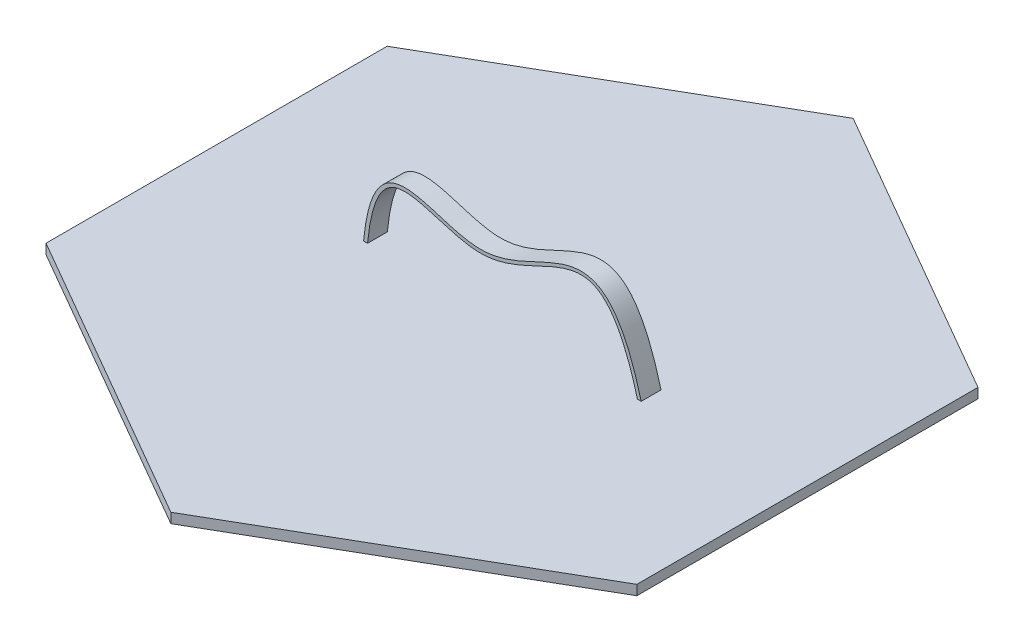
ISO-10303-21;
HEADER;
FILE_DESCRIPTION(('STEP AP214'),'2;1');
FILE_NAME('part.step','',(''),(''),'','','');
FILE_SCHEMA(('AUTOMOTIVE_DESIGN { 1 0 10303 214 1 1 1 1 }'));
ENDSEC;
DATA;
#1=APPLICATION_CONTEXT('core data for automotive mechanical design processes');
#2=APPLICATION_PROTOCOL_DEFINITION('international standard','automotive_design',2000,#1);
#3=PRODUCT_CONTEXT('',#1,'mechanical');
#4=PRODUCT('Part','Part','',(#3));
#5=PRODUCT_RELATED_PRODUCT_CATEGORY('part','',(#4));
#6=PRODUCT_DEFINITION_FORMATION('','',#4);
#7=PRODUCT_DEFINITION_CONTEXT('part definition',#1,'design');
#8=PRODUCT_DEFINITION('design','',#6,#7);
#9=PRODUCT_DEFINITION_SHAPE('','',#8);
#10=(LENGTH_UNIT() NAMED_UNIT(*) SI_UNIT(.MILLI.,.METRE.));
#11=(NAMED_UNIT(*) PLANE_ANGLE_UNIT() SI_UNIT($,.RADIAN.));
#12=(NAMED_UNIT(*) SI_UNIT($,.STERADIAN.) SOLID_ANGLE_UNIT());
#13=UNCERTAINTY_MEASURE_WITH_UNIT(LENGTH_MEASURE(1.E-05),#10,'distance_accuracy_value','');
#14=(GEOMETRIC_REPRESENTATION_CONTEXT(3) GLOBAL_UNCERTAINTY_ASSIGNED_CONTEXT((#13)) GLOBAL_UNIT_ASSIGNED_CONTEXT((#10,
#11,#12)) REPRESENTATION_CONTEXT('',''));
#15=CARTESIAN_POINT('',(0.,0.,0.));
#16=DIRECTION('',(0.,0.,1.));
#17=DIRECTION('',(1.,0.,0.));
#18=AXIS2_PLACEMENT_3D('',#15,#16,#17);
#19=CARTESIAN_POINT('',(0.,2.5,-86.));
#20=DIRECTION('',(0.5,0.,0.866025403784439));
#21=DIRECTION('',(0.866025403784439,0.,-0.5));
#22=AXIS2_PLACEMENT_3D('',#19,#20,#21);
#23=PLANE('',#22);
#24=DIRECTION('',(-0.866025403784439,0.,0.5));
#25=VECTOR('',#24,1.);
#26=CARTESIAN_POINT('',(0.,0.,-86.));
#27=LINE('',#26,#25);
#28=CARTESIAN_POINT('',(0.,0.,-86.));
#29=VERTEX_POINT('',#28);
#30=CARTESIAN_POINT('',(-74.4781847254617,0.,-43.));
#31=VERTEX_POINT('',#30);
#32=EDGE_CURVE('E124',#29,#31,#27,.T.);
#33=ORIENTED_EDGE('',*,*,#32,.T.);
#34=DIRECTION('',(0.,-1.,0.));
#35=VECTOR('',#34,1.);
#36=CARTESIAN_POINT('',(-74.4781847254617,2.5,-43.));
#37=LINE('',#36,#35);
#38=CARTESIAN_POINT('',(-74.4781847254617,2.5,-43.));
#39=VERTEX_POINT('',#38);
#40=EDGE_CURVE('E11',#39,#31,#37,.T.);
#41=ORIENTED_EDGE('',*,*,#40,.F.);
#42=DIRECTION('',(-0.866025403784439,0.,0.5));
#43=VECTOR('',#42,1.);
#44=CARTESIAN_POINT('',(0.,2.5,-86.));
#45=LINE('',#44,#43);
#46=CARTESIAN_POINT('',(0.,2.5,-86.));
#47=VERTEX_POINT('',#46);
#48=EDGE_CURVE('E208',#47,#39,#45,.T.);
#49=ORIENTED_EDGE('',*,*,#48,.F.);
#50=DIRECTION('',(0.,-1.,0.));
#51=VECTOR('',#50,1.);
#52=CARTESIAN_POINT('',(0.,2.5,-86.));
#53=LINE('',#52,#51);
#54=EDGE_CURVE('E209',#47,#29,#53,.T.);
#55=ORIENTED_EDGE('',*,*,#54,.T.);
#56=EDGE_LOOP('',(#33,#41,#49,#55));
#57=FACE_BOUND('',#56,.T.);
#58=ADVANCED_FACE('F33',(#57),#23,.F.);
#59=CARTESIAN_POINT('',(-74.4781847254617,2.5,-43.));
#60=DIRECTION('',(1.,0.,0.));
#61=DIRECTION('',(0.,0.,-1.));
#62=AXIS2_PLACEMENT_3D('',#59,#60,#61);
#63=PLANE('',#62);
#64=DIRECTION('',(0.,0.,1.));
#65=VECTOR('',#64,1.);
#66=CARTESIAN_POINT('',(-74.4781847254617,0.,-43.));
#67=LINE('',#66,#65);
#68=CARTESIAN_POINT('',(-74.4781847254617,0.,43.));
#69=VERTEX_POINT('',#68);
#70=EDGE_CURVE('E184',#31,#69,#67,.T.);
#71=ORIENTED_EDGE('',*,*,#70,.T.);
#72=DIRECTION('',(0.,-1.,0.));
#73=VECTOR('',#72,1.);
#74=CARTESIAN_POINT('',(-74.4781847254617,2.5,43.));
#75=LINE('',#74,#73);
#76=CARTESIAN_POINT('',(-74.4781847254617,2.5,43.));
#77=VERTEX_POINT('',#76);
#78=EDGE_CURVE('E40',#77,#69,#75,.T.);
#79=ORIENTED_EDGE('',*,*,#78,.F.);
#80=DIRECTION('',(0.,0.,1.));
#81=VECTOR('',#80,1.);
#82=CARTESIAN_POINT('',(-74.4781847254617,2.5,-43.));
#83=LINE('',#82,#81);
#84=EDGE_CURVE('E226',#39,#77,#83,.T.);
#85=ORIENTED_EDGE('',*,*,#84,.F.);
#86=ORIENTED_EDGE('',*,*,#40,.T.);
#87=EDGE_LOOP('',(#71,#79,#85,#86));
#88=FACE_BOUND('',#87,.T.);
#89=ADVANCED_FACE('F175',(#88),#63,.F.);
#90=CARTESIAN_POINT('',(-74.4781847254617,2.5,43.));
#91=DIRECTION('',(0.5,0.,-0.866025403784439));
#92=DIRECTION('',(-0.866025403784439,0.,-0.5));
#93=AXIS2_PLACEMENT_3D('',#90,#91,#92);
#94=PLANE('',#93);
#95=DIRECTION('',(0.866025403784439,0.,0.5));
#96=VECTOR('',#95,1.);
#97=CARTESIAN_POINT('',(-74.4781847254617,0.,43.));
#98=LINE('',#97,#96);
#99=CARTESIAN_POINT('',(0.,0.,86.));
#100=VERTEX_POINT('',#99);
#101=EDGE_CURVE('E191',#69,#100,#98,.T.);
#102=ORIENTED_EDGE('',*,*,#101,.T.);
#103=DIRECTION('',(0.,-1.,0.));
#104=VECTOR('',#103,1.);
#105=CARTESIAN_POINT('',(0.,2.5,86.));
#106=LINE('',#105,#104);
#107=CARTESIAN_POINT('',(0.,2.5,86.));
#108=VERTEX_POINT('',#107);
#109=EDGE_CURVE('E196',#108,#100,#106,.T.);
#110=ORIENTED_EDGE('',*,*,#109,.F.);
#111=DIRECTION('',(0.866025403784439,0.,0.5));
#112=VECTOR('',#111,1.);
#113=CARTESIAN_POINT('',(-74.4781847254617,2.5,43.));
#114=LINE('',#113,#112);
#115=EDGE_CURVE('E195',#77,#108,#114,.T.);
#116=ORIENTED_EDGE('',*,*,#115,.F.);
#117=ORIENTED_EDGE('',*,*,#78,.T.);
#118=EDGE_LOOP('',(#102,#110,#116,#117));
#119=FACE_BOUND('',#118,.T.);
#120=ADVANCED_FACE('F172',(#119),#94,.F.);
#121=CARTESIAN_POINT('',(0.,2.5,86.));
#122=DIRECTION('',(-0.5,0.,-0.866025403784439));
#123=DIRECTION('',(-0.866025403784439,0.,0.5));
#124=AXIS2_PLACEMENT_3D('',#121,#122,#123);
#125=PLANE('',#124);
#126=DIRECTION('',(0.866025403784439,0.,-0.5));
#127=VECTOR('',#126,1.);
#128=CARTESIAN_POINT('',(0.,0.,86.));
#129=LINE('',#128,#127);
#130=CARTESIAN_POINT('',(74.4781847254617,0.,43.));
#131=VERTEX_POINT('',#130);
#132=EDGE_CURVE('E199',#100,#131,#129,.T.);
#133=ORIENTED_EDGE('',*,*,#132,.T.);
#134=DIRECTION('',(0.,-1.,0.));
#135=VECTOR('',#134,1.);
#136=CARTESIAN_POINT('',(74.4781847254617,2.5,43.));
#137=LINE('',#136,#135);
#138=CARTESIAN_POINT('',(74.4781847254617,2.5,43.));
#139=VERTEX_POINT('',#138);
#140=EDGE_CURVE('E216',#139,#131,#137,.T.);
#141=ORIENTED_EDGE('',*,*,#140,.F.);
#142=DIRECTION('',(0.866025403784439,0.,-0.5));
#143=VECTOR('',#142,1.);
#144=CARTESIAN_POINT('',(0.,2.5,86.));
#145=LINE('',#144,#143);
#146=EDGE_CURVE('E221',#108,#139,#145,.T.);
#147=ORIENTED_EDGE('',*,*,#146,.F.);
#148=ORIENTED_EDGE('',*,*,#109,.T.);
#149=EDGE_LOOP('',(#133,#141,#147,#148));
#150=FACE_BOUND('',#149,.T.);
#151=ADVANCED_FACE('F168',(#150),#125,.F.);
#152=CARTESIAN_POINT('',(74.4781847254617,2.5,43.));
#153=DIRECTION('',(-1.,0.,0.));
#154=DIRECTION('',(0.,0.,1.));
#155=AXIS2_PLACEMENT_3D('',#152,#153,#154);
#156=PLANE('',#155);
#157=DIRECTION('',(0.,0.,-1.));
#158=VECTOR('',#157,1.);
#159=CARTESIAN_POINT('',(74.4781847254617,0.,43.));
#160=LINE('',#159,#158);
#161=CARTESIAN_POINT('',(74.4781847254617,0.,-43.));
#162=VERTEX_POINT('',#161);
#163=EDGE_CURVE('E201',#131,#162,#160,.T.);
#164=ORIENTED_EDGE('',*,*,#163,.T.);
#165=DIRECTION('',(0.,-1.,0.));
#166=VECTOR('',#165,1.);
#167=CARTESIAN_POINT('',(74.4781847254617,2.5,-43.));
#168=LINE('',#167,#166);
#169=CARTESIAN_POINT('',(74.4781847254617,2.5,-43.));
#170=VERTEX_POINT('',#169);
#171=EDGE_CURVE('E212',#170,#162,#168,.T.);
#172=ORIENTED_EDGE('',*,*,#171,.F.);
#173=DIRECTION('',(0.,0.,-1.));
#174=VECTOR('',#173,1.);
#175=CARTESIAN_POINT('',(74.4781847254617,2.5,43.));
#176=LINE('',#175,#174);
#177=EDGE_CURVE('E223',#139,#170,#176,.T.);
#178=ORIENTED_EDGE('',*,*,#177,.F.);
#179=ORIENTED_EDGE('',*,*,#140,.T.);
#180=EDGE_LOOP('',(#164,#172,#178,#179));
#181=FACE_BOUND('',#180,.T.);
#182=ADVANCED_FACE('F164',(#181),#156,.F.);
#183=CARTESIAN_POINT('',(74.4781847254617,2.5,-43.));
#184=DIRECTION('',(-0.5,0.,0.866025403784439));
#185=DIRECTION('',(0.866025403784439,0.,0.5));
#186=AXIS2_PLACEMENT_3D('',#183,#184,#185);
#187=PLANE('',#186);
#188=DIRECTION('',(-0.866025403784439,0.,-0.5));
#189=VECTOR('',#188,1.);
#190=CARTESIAN_POINT('',(74.4781847254617,0.,-43.));
#191=LINE('',#190,#189);
#192=EDGE_CURVE('E206',#162,#29,#191,.T.);
#193=ORIENTED_EDGE('',*,*,#192,.T.);
#194=ORIENTED_EDGE('',*,*,#54,.F.);
#195=DIRECTION('',(-0.866025403784439,0.,-0.5));
#196=VECTOR('',#195,1.);
#197=CARTESIAN_POINT('',(74.4781847254617,2.5,-43.));
#198=LINE('',#197,#196);
#199=EDGE_CURVE('E213',#170,#47,#198,.T.);
#200=ORIENTED_EDGE('',*,*,#199,.F.);
#201=ORIENTED_EDGE('',*,*,#171,.T.);
#202=EDGE_LOOP('',(#193,#194,#200,#201));
#203=FACE_BOUND('',#202,.T.);
#204=ADVANCED_FACE('F157',(#203),#187,.F.);
#205=CARTESIAN_POINT('',(0.,2.5,0.));
#206=DIRECTION('',(0.,1.,0.));
#207=DIRECTION('',(0.,0.,1.));
#208=AXIS2_PLACEMENT_3D('',#205,#206,#207);
#209=PLANE('',#208);
#210=DIRECTION('',(1.,0.,0.));
#211=VECTOR('',#210,1.);
#212=CARTESIAN_POINT('',(-34.9250617849398,2.5,2.5));
#213=LINE('',#212,#211);
#214=CARTESIAN_POINT('',(-34.9250617849398,2.5,2.5));
#215=VERTEX_POINT('',#214);
#216=CARTESIAN_POINT('',(-33.9200584475239,2.5,2.5));
#217=VERTEX_POINT('',#216);
#218=EDGE_CURVE('E114',#215,#217,#213,.T.);
#219=ORIENTED_EDGE('',*,*,#218,.F.);
#220=DIRECTION('',(0.,0.,-1.));
#221=VECTOR('',#220,1.);
#222=CARTESIAN_POINT('',(-34.9250617849398,2.5,2.5));
#223=LINE('',#222,#221);
#224=CARTESIAN_POINT('',(-34.9250617849398,2.5,-2.5));
#225=VERTEX_POINT('',#224);
#226=EDGE_CURVE('E239',#215,#225,#223,.T.);
#227=ORIENTED_EDGE('',*,*,#226,.T.);
#228=DIRECTION('',(1.,0.,0.));
#229=VECTOR('',#228,1.);
#230=CARTESIAN_POINT('',(-34.9250617849398,2.5,-2.5));
#231=LINE('',#230,#229);
#232=CARTESIAN_POINT('',(-33.9200584475239,2.5,-2.5));
#233=VERTEX_POINT('',#232);
#234=EDGE_CURVE('E117',#225,#233,#231,.T.);
#235=ORIENTED_EDGE('',*,*,#234,.T.);
#236=DIRECTION('',(0.,0.,-1.));
#237=VECTOR('',#236,1.);
#238=CARTESIAN_POINT('',(-33.9200584475239,2.5,2.5));
#239=LINE('',#238,#237);
#240=EDGE_CURVE('E242',#217,#233,#239,.T.);
#241=ORIENTED_EDGE('',*,*,#240,.F.);
#242=EDGE_LOOP('',(#219,#227,#235,#241));
#243=FACE_BOUND('',#242,.T.);
#244=DIRECTION('',(1.,0.,0.));
#245=VECTOR('',#244,1.);
#246=CARTESIAN_POINT('',(34.1190559883734,2.5,2.5));
#247=LINE('',#246,#245);
#248=CARTESIAN_POINT('',(34.1190559883734,2.5,2.5));
#249=VERTEX_POINT('',#248);
#250=CARTESIAN_POINT('',(35.0749382150602,2.49999999999995,2.5));
#251=VERTEX_POINT('',#250);
#252=EDGE_CURVE('E111',#249,#251,#247,.T.);
#253=ORIENTED_EDGE('',*,*,#252,.F.);
#254=DIRECTION('',(0.,0.,-1.));
#255=VECTOR('',#254,1.);
#256=CARTESIAN_POINT('',(34.1190559883734,2.5,2.5));
#257=LINE('',#256,#255);
#258=CARTESIAN_POINT('',(34.1190559883734,2.5,-2.5));
#259=VERTEX_POINT('',#258);
#260=EDGE_CURVE('E120',#249,#259,#257,.T.);
#261=ORIENTED_EDGE('',*,*,#260,.T.);
#262=DIRECTION('',(1.,0.,0.));
#263=VECTOR('',#262,1.);
#264=CARTESIAN_POINT('',(34.1190559883734,2.5,-2.5));
#265=LINE('',#264,#263);
#266=CARTESIAN_POINT('',(35.0749382150602,2.5,-2.5));
#267=VERTEX_POINT('',#266);
#268=EDGE_CURVE('E249',#259,#267,#265,.T.);
#269=ORIENTED_EDGE('',*,*,#268,.T.);
#270=DIRECTION('',(0.,0.,-1.));
#271=VECTOR('',#270,1.);
#272=CARTESIAN_POINT('',(35.0749382150602,2.49999999999995,2.5));
#273=LINE('',#272,#271);
#274=EDGE_CURVE('E125',#251,#267,#273,.T.);
#275=ORIENTED_EDGE('',*,*,#274,.F.);
#276=EDGE_LOOP('',(#253,#261,#269,#275));
#277=FACE_BOUND('',#276,.T.);
#278=ORIENTED_EDGE('',*,*,#48,.T.);
#279=ORIENTED_EDGE('',*,*,#84,.T.);
#280=ORIENTED_EDGE('',*,*,#115,.T.);
#281=ORIENTED_EDGE('',*,*,#146,.T.);
#282=ORIENTED_EDGE('',*,*,#177,.T.);
#283=ORIENTED_EDGE('',*,*,#199,.T.);
#284=EDGE_LOOP('',(#278,#279,#280,#281,#282,#283));
#285=FACE_BOUND('',#284,.T.);
#286=ADVANCED_FACE('F128',(#243,#277,#285),#209,.T.);
#287=CARTESIAN_POINT('',(0.,0.,0.));
#288=DIRECTION('',(0.,1.,0.));
#289=DIRECTION('',(0.,0.,1.));
#290=AXIS2_PLACEMENT_3D('',#287,#288,#289);
#291=PLANE('',#290);
#292=ORIENTED_EDGE('',*,*,#32,.F.);
#293=ORIENTED_EDGE('',*,*,#192,.F.);
#294=ORIENTED_EDGE('',*,*,#163,.F.);
#295=ORIENTED_EDGE('',*,*,#132,.F.);
#296=ORIENTED_EDGE('',*,*,#101,.F.);
#297=ORIENTED_EDGE('',*,*,#70,.F.);
#298=EDGE_LOOP('',(#292,#293,#294,#295,#296,#297));
#299=FACE_BOUND('',#298,.T.);
#300=ADVANCED_FACE('F154',(#299),#291,.F.);
#301=CARTESIAN_POINT('',(-33.9200584475239,2.5,2.5));
#302=CARTESIAN_POINT('',(-33.9177143325636,2.52413694174797,2.5));
#303=CARTESIAN_POINT('',(-33.9136116527788,2.56616643918834,2.5));
#304=CARTESIAN_POINT('',(-33.8662278240149,3.04735851834717,2.5));
#305=CARTESIAN_POINT('',(-33.7666752233706,3.96865699691198,2.5));
#306=CARTESIAN_POINT('',(-33.5436360651481,5.69749299781174,2.5));
#307=CARTESIAN_POINT('',(-33.2080943051446,7.72703652432647,2.5));
#308=CARTESIAN_POINT('',(-32.732470915195,9.85768853695971,2.5));
#309=CARTESIAN_POINT('',(-32.0075975155245,12.3221702002531,2.5));
#310=CARTESIAN_POINT('',(-30.9478275649644,14.7261092440909,2.5));
#311=CARTESIAN_POINT('',(-29.4968434912772,16.6565994781057,2.5));
#312=CARTESIAN_POINT('',(-27.9188081773819,17.8177887863066,2.5));
#313=CARTESIAN_POINT('',(-25.5840895159834,18.6160232771715,2.5));
#314=CARTESIAN_POINT('',(-22.0270895729511,18.448365094974,2.5));
#315=CARTESIAN_POINT('',(-16.9805974141659,17.0145463199876,2.5));
#316=CARTESIAN_POINT('',(-11.5044171122936,15.3014425360311,2.5));
#317=CARTESIAN_POINT('',(-6.72714507052084,14.4532094188109,2.5));
#318=CARTESIAN_POINT('',(-2.88936779098288,14.698102091052,2.5));
#319=CARTESIAN_POINT('',(0.821978205898652,15.4887176543566,2.5));
#320=CARTESIAN_POINT('',(5.27086506114926,17.2040857835767,2.5));
#321=CARTESIAN_POINT('',(10.3102869511778,19.6583412296191,2.5));
#322=CARTESIAN_POINT('',(15.0424534268237,21.7680858312845,2.5));
#323=CARTESIAN_POINT('',(18.653774649225,22.6405678765743,2.5));
#324=CARTESIAN_POINT('',(21.3005425590054,22.5247529083881,2.5));
#325=CARTESIAN_POINT('',(23.1969660158137,21.9759500319166,2.5));
#326=CARTESIAN_POINT('',(25.0648199400271,20.8678489883476,2.5));
#327=CARTESIAN_POINT('',(26.9361625824523,19.0647867495854,2.5));
#328=CARTESIAN_POINT('',(28.7987258490362,16.441516785524,2.5));
#329=CARTESIAN_POINT('',(30.3241876203291,13.4886828336136,2.5));
#330=CARTESIAN_POINT('',(31.5199636253178,10.621236271459,2.5));
#331=CARTESIAN_POINT('',(32.402488107439,8.20915902535785,2.5));
#332=CARTESIAN_POINT('',(33.1266072061214,5.96594201261729,2.5));
#333=CARTESIAN_POINT('',(33.6652572138912,4.14030108231586,2.5));
#334=CARTESIAN_POINT('',(33.9317762848707,3.18771633636609,2.5));
#335=CARTESIAN_POINT('',(34.072246391056,2.67284067403823,2.5));
#336=CARTESIAN_POINT('',(34.1019065155648,2.56346499958978,2.5));
#337=CARTESIAN_POINT('',(34.1190559883734,2.5,2.5));
#338=B_SPLINE_CURVE_WITH_KNOTS('',3,(#301,#302,#303,#304,#305,#306,#307,#308,#309,#310,#311,
#312,#313,#314,#315,#316,#317,#318,#319,#320,#321,#322,#323,#324,#325,#326,#327,#328,#329,#330,
#331,#332,#333,#334,#335,#336,#337),.UNSPECIFIED.,.F.,.F.,(4,1,1,1,1,1,1,1,1,1,1,1,1,1,1,1,1,1,
1,1,1,1,1,1,1,1,1,1,1,1,1,1,1,1,4),(0.,0.000400294959063591,0.000667158265105985,0.0078125,
0.015625,0.03125,0.046875,0.0625,0.09375,0.125,0.15625,0.1875,0.25,0.3125,0.375,0.4375,0.46875,
0.5,0.5625,0.625,0.6875,0.75,0.78125,0.8125,0.84375,0.875,0.90625,0.9375,0.953125,0.96875,
0.984375,0.9921875,0.998375544183594,0.999025326510156,1.),.UNSPECIFIED.);
#339=DIRECTION('',(0.,0.,-1.));
#340=VECTOR('',#339,1.);
#341=SURFACE_OF_LINEAR_EXTRUSION('',#338,#340);
#342=CARTESIAN_POINT('',(-33.9200584475239,2.5,-2.5));
#343=CARTESIAN_POINT('',(-33.9177143325636,2.52413694174797,-2.5));
#344=CARTESIAN_POINT('',(-33.9136116527788,2.56616643918834,-2.5));
#345=CARTESIAN_POINT('',(-33.8662278240149,3.04735851834717,-2.5));
#346=CARTESIAN_POINT('',(-33.7666752233706,3.96865699691198,-2.5));
#347=CARTESIAN_POINT('',(-33.5436360651481,5.69749299781174,-2.5));
#348=CARTESIAN_POINT('',(-33.2080943051446,7.72703652432647,-2.5));
#349=CARTESIAN_POINT('',(-32.732470915195,9.85768853695971,-2.5));
#350=CARTESIAN_POINT('',(-32.0075975155245,12.3221702002531,-2.5));
#351=CARTESIAN_POINT('',(-30.9478275649644,14.7261092440909,-2.5));
#352=CARTESIAN_POINT('',(-29.4968434912772,16.6565994781057,-2.5));
#353=CARTESIAN_POINT('',(-27.9188081773819,17.8177887863066,-2.5));
#354=CARTESIAN_POINT('',(-25.5840895159834,18.6160232771715,-2.5));
#355=CARTESIAN_POINT('',(-22.0270895729511,18.448365094974,-2.5));
#356=CARTESIAN_POINT('',(-16.9805974141659,17.0145463199876,-2.5));
#357=CARTESIAN_POINT('',(-11.5044171122936,15.3014425360311,-2.5));
#358=CARTESIAN_POINT('',(-6.72714507052084,14.4532094188109,-2.5));
#359=CARTESIAN_POINT('',(-2.88936779098288,14.698102091052,-2.5));
#360=CARTESIAN_POINT('',(0.821978205898652,15.4887176543566,-2.5));
#361=CARTESIAN_POINT('',(5.27086506114926,17.2040857835767,-2.5));
#362=CARTESIAN_POINT('',(10.3102869511778,19.6583412296191,-2.5));
#363=CARTESIAN_POINT('',(15.0424534268237,21.7680858312845,-2.5));
#364=CARTESIAN_POINT('',(18.653774649225,22.6405678765743,-2.5));
#365=CARTESIAN_POINT('',(21.3005425590054,22.5247529083881,-2.5));
#366=CARTESIAN_POINT('',(23.1969660158137,21.9759500319166,-2.5));
#367=CARTESIAN_POINT('',(25.0648199400271,20.8678489883476,-2.5));
#368=CARTESIAN_POINT('',(26.9361625824523,19.0647867495854,-2.5));
#369=CARTESIAN_POINT('',(28.7987258490362,16.441516785524,-2.5));
#370=CARTESIAN_POINT('',(30.3241876203291,13.4886828336136,-2.5));
#371=CARTESIAN_POINT('',(31.5199636253178,10.621236271459,-2.5));
#372=CARTESIAN_POINT('',(32.402488107439,8.20915902535785,-2.5));
#373=CARTESIAN_POINT('',(33.1266072061214,5.96594201261729,-2.5));
#374=CARTESIAN_POINT('',(33.6652572138912,4.14030108231586,-2.5));
#375=CARTESIAN_POINT('',(33.9317762848707,3.18771633636609,-2.5));
#376=CARTESIAN_POINT('',(34.072246391056,2.67284067403823,-2.5));
#377=CARTESIAN_POINT('',(34.1019065155648,2.56346499958978,-2.5));
#378=CARTESIAN_POINT('',(34.1190559883734,2.5,-2.5));
#379=B_SPLINE_CURVE_WITH_KNOTS('',3,(#342,#343,#344,#345,#346,#347,#348,#349,#350,#351,#352,
#353,#354,#355,#356,#357,#358,#359,#360,#361,#362,#363,#364,#365,#366,#367,#368,#369,#370,#371,
#372,#373,#374,#375,#376,#377,#378),.UNSPECIFIED.,.F.,.F.,(4,1,1,1,1,1,1,1,1,1,1,1,1,1,1,1,1,1,
1,1,1,1,1,1,1,1,1,1,1,1,1,1,1,1,4),(0.,0.000400294959063591,0.000667158265105985,0.0078125,
0.015625,0.03125,0.046875,0.0625,0.09375,0.125,0.15625,0.1875,0.25,0.3125,0.375,0.4375,0.46875,
0.5,0.5625,0.625,0.6875,0.75,0.78125,0.8125,0.84375,0.875,0.90625,0.9375,0.953125,0.96875,
0.984375,0.9921875,0.998375544183594,0.999025326510156,1.),.UNSPECIFIED.);
#380=EDGE_CURVE('E47',#233,#259,#379,.T.);
#381=ORIENTED_EDGE('',*,*,#380,.T.);
#382=ORIENTED_EDGE('',*,*,#260,.F.);
#383=EDGE_CURVE('E107',#217,#249,#338,.T.);
#384=ORIENTED_EDGE('',*,*,#383,.F.);
#385=ORIENTED_EDGE('',*,*,#240,.T.);
#386=EDGE_LOOP('',(#381,#382,#384,#385));
#387=FACE_BOUND('',#386,.T.);
#388=ADVANCED_FACE('F121',(#387),#341,.F.);
#389=CARTESIAN_POINT('',(35.0749382150602,2.49999999999995,2.5));
#390=CARTESIAN_POINT('',(25.0791547452939,39.8389449316259,2.5));
#391=CARTESIAN_POINT('',(-0.320997251045717,-3.69509039273915,2.5));
#392=CARTESIAN_POINT('',(-32.1505411875636,30.3886346653858,2.5));
#393=CARTESIAN_POINT('',(-34.9250617849398,2.49999999999999,2.5));
#394=B_SPLINE_CURVE_WITH_KNOTS('',3,(#389,#390,#391,#392,#393),.UNSPECIFIED.,.F.,.F.,(4,1,4),
(0.,0.555741929141986,1.),.UNSPECIFIED.);
#395=DIRECTION('',(0.,0.,-1.));
#396=VECTOR('',#395,1.);
#397=SURFACE_OF_LINEAR_EXTRUSION('',#394,#396);
#398=CARTESIAN_POINT('',(35.0749382150602,2.49999999999995,-2.5));
#399=CARTESIAN_POINT('',(25.0791547452939,39.8389449316259,-2.5));
#400=CARTESIAN_POINT('',(-0.320997251045717,-3.69509039273915,-2.5));
#401=CARTESIAN_POINT('',(-32.1505411875636,30.3886346653858,-2.5));
#402=CARTESIAN_POINT('',(-34.9250617849398,2.49999999999999,-2.5));
#403=B_SPLINE_CURVE_WITH_KNOTS('',3,(#398,#399,#400,#401,#402),.UNSPECIFIED.,.F.,.F.,(4,1,4),
(0.,0.555741929141986,1.),.UNSPECIFIED.);
#404=EDGE_CURVE('E52',#267,#225,#403,.T.);
#405=ORIENTED_EDGE('',*,*,#404,.T.);
#406=ORIENTED_EDGE('',*,*,#226,.F.);
#407=EDGE_CURVE('E130',#251,#215,#394,.T.);
#408=ORIENTED_EDGE('',*,*,#407,.F.);
#409=ORIENTED_EDGE('',*,*,#274,.T.);
#410=EDGE_LOOP('',(#405,#406,#408,#409));
#411=FACE_BOUND('',#410,.T.);
#412=ADVANCED_FACE('F145',(#411),#397,.F.);
#413=CARTESIAN_POINT('',(-0.118544669378486,15.3395370085364,2.5));
#414=DIRECTION('',(0.,0.,1.));
#415=DIRECTION('',(1.,0.,0.));
#416=AXIS2_PLACEMENT_3D('',#413,#414,#415);
#417=PLANE('',#416);
#418=ORIENTED_EDGE('',*,*,#383,.T.);
#419=ORIENTED_EDGE('',*,*,#252,.T.);
#420=ORIENTED_EDGE('',*,*,#407,.T.);
#421=ORIENTED_EDGE('',*,*,#218,.T.);
#422=EDGE_LOOP('',(#418,#419,#420,#421));
#423=FACE_BOUND('',#422,.T.);
#424=ADVANCED_FACE('F109',(#423),#417,.T.);
#425=CARTESIAN_POINT('',(-0.118544669378486,15.3395370085364,-2.5));
#426=DIRECTION('',(0.,0.,1.));
#427=DIRECTION('',(1.,0.,0.));
#428=AXIS2_PLACEMENT_3D('',#425,#426,#427);
#429=PLANE('',#428);
#430=ORIENTED_EDGE('',*,*,#380,.F.);
#431=ORIENTED_EDGE('',*,*,#234,.F.);
#432=ORIENTED_EDGE('',*,*,#404,.F.);
#433=ORIENTED_EDGE('',*,*,#268,.F.);
#434=EDGE_LOOP('',(#430,#431,#432,#433));
#435=FACE_BOUND('',#434,.T.);
#436=ADVANCED_FACE('F150',(#435),#429,.F.);
#437=CLOSED_SHELL('',(#58,#89,#120,#151,#182,#204,#286,#300,#388,#412,#424,#436));
#438=MANIFOLD_SOLID_BREP('B2',#437);
#439=ADVANCED_BREP_SHAPE_REPRESENTATION('',(#18,#438),#14);
#440=SHAPE_DEFINITION_REPRESENTATION(#9,#439);
ENDSEC;
END-ISO-10303-21;
